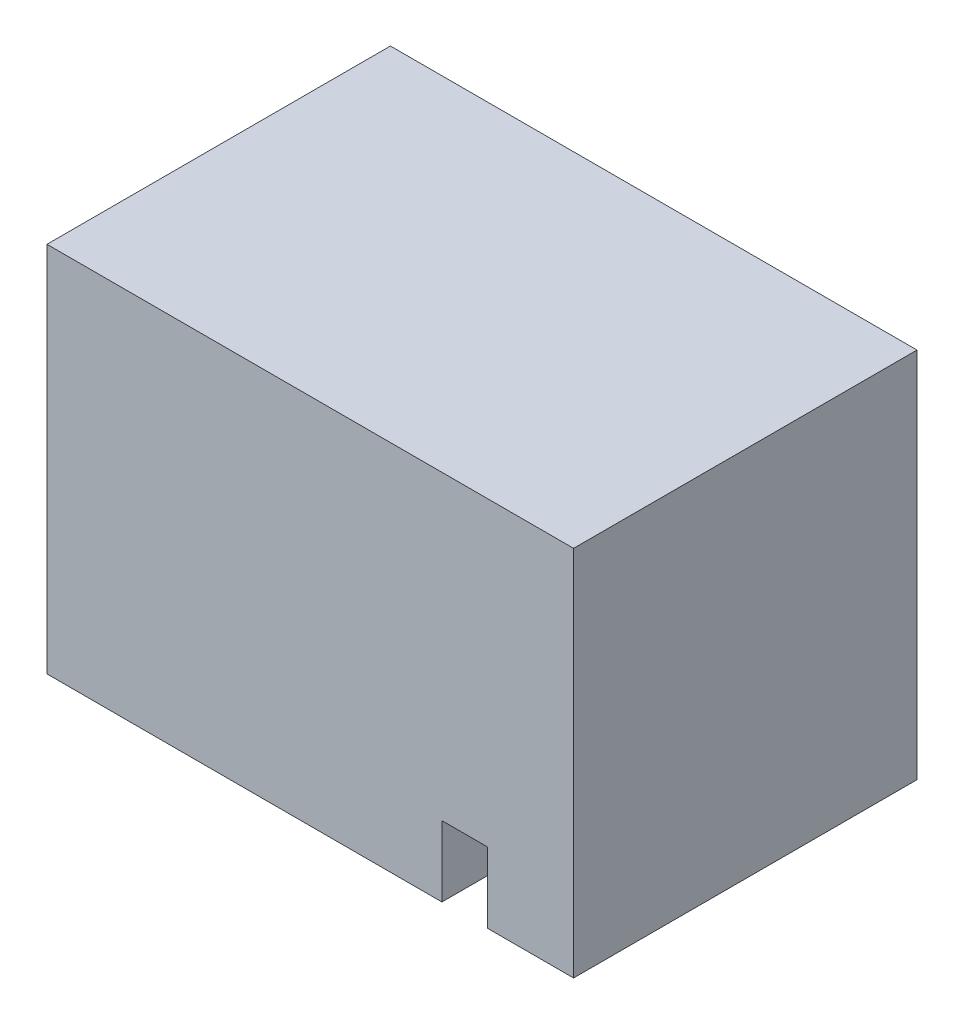
ISO-10303-21;
HEADER;
FILE_DESCRIPTION(('STEP AP214'),'2;1');
FILE_NAME('part.step','',(''),(''),'','','');
FILE_SCHEMA(('AUTOMOTIVE_DESIGN { 1 0 10303 214 1 1 1 1 }'));
ENDSEC;
DATA;
#1=APPLICATION_CONTEXT('core data for automotive mechanical design processes');
#2=APPLICATION_PROTOCOL_DEFINITION('international standard','automotive_design',2000,#1);
#3=PRODUCT_CONTEXT('',#1,'mechanical');
#4=PRODUCT('Part','Part','',(#3));
#5=PRODUCT_RELATED_PRODUCT_CATEGORY('part','',(#4));
#6=PRODUCT_DEFINITION_FORMATION('','',#4);
#7=PRODUCT_DEFINITION_CONTEXT('part definition',#1,'design');
#8=PRODUCT_DEFINITION('design','',#6,#7);
#9=PRODUCT_DEFINITION_SHAPE('','',#8);
#10=(LENGTH_UNIT() NAMED_UNIT(*) SI_UNIT(.MILLI.,.METRE.));
#11=(NAMED_UNIT(*) PLANE_ANGLE_UNIT() SI_UNIT($,.RADIAN.));
#12=(NAMED_UNIT(*) SI_UNIT($,.STERADIAN.) SOLID_ANGLE_UNIT());
#13=UNCERTAINTY_MEASURE_WITH_UNIT(LENGTH_MEASURE(1.E-05),#10,'distance_accuracy_value','');
#14=(GEOMETRIC_REPRESENTATION_CONTEXT(3) GLOBAL_UNCERTAINTY_ASSIGNED_CONTEXT((#13)) GLOBAL_UNIT_ASSIGNED_CONTEXT((#10,
#11,#12)) REPRESENTATION_CONTEXT('',''));
#15=CARTESIAN_POINT('',(0.,0.,0.));
#16=DIRECTION('',(0.,0.,1.));
#17=DIRECTION('',(1.,0.,0.));
#18=AXIS2_PLACEMENT_3D('',#15,#16,#17);
#19=CARTESIAN_POINT('',(0.,12.31,60.));
#20=DIRECTION('',(0.,1.,0.));
#21=DIRECTION('',(0.,0.,1.));
#22=AXIS2_PLACEMENT_3D('',#19,#20,#21);
#23=PLANE('',#22);
#24=DIRECTION('',(0.,0.,-1.));
#25=VECTOR('',#24,1.);
#26=CARTESIAN_POINT('',(69.,12.31,60.));
#27=LINE('',#26,#25);
#28=CARTESIAN_POINT('',(69.,12.31,60.));
#29=VERTEX_POINT('',#28);
#30=CARTESIAN_POINT('',(69.,12.31,26.01546));
#31=VERTEX_POINT('',#30);
#32=EDGE_CURVE('E54',#29,#31,#27,.T.);
#33=ORIENTED_EDGE('',*,*,#32,.T.);
#34=DIRECTION('',(1.,0.,0.));
#35=VECTOR('',#34,1.);
#36=CARTESIAN_POINT('',(0.,12.31,26.01546));
#37=LINE('',#36,#35);
#38=CARTESIAN_POINT('',(77.001,12.31,26.01546));
#39=VERTEX_POINT('',#38);
#40=EDGE_CURVE('E178',#31,#39,#37,.T.);
#41=ORIENTED_EDGE('',*,*,#40,.T.);
#42=DIRECTION('',(0.,0.,-1.));
#43=VECTOR('',#42,1.);
#44=CARTESIAN_POINT('',(77.001,12.31,60.));
#45=LINE('',#44,#43);
#46=CARTESIAN_POINT('',(77.001,12.31,60.));
#47=VERTEX_POINT('',#46);
#48=EDGE_CURVE('E245',#47,#39,#45,.T.);
#49=ORIENTED_EDGE('',*,*,#48,.F.);
#50=DIRECTION('',(1.,0.,0.));
#51=VECTOR('',#50,1.);
#52=CARTESIAN_POINT('',(0.,12.31,60.));
#53=LINE('',#52,#51);
#54=EDGE_CURVE('E193',#29,#47,#53,.T.);
#55=ORIENTED_EDGE('',*,*,#54,.F.);
#56=EDGE_LOOP('',(#33,#41,#49,#55));
#57=FACE_BOUND('',#56,.T.);
#58=DIRECTION('',(1.,0.,0.));
#59=VECTOR('',#58,1.);
#60=CARTESIAN_POINT('',(0.,12.31,31.00046));
#61=LINE('',#60,#59);
#62=CARTESIAN_POINT('',(72.0005,12.31,31.00046));
#63=VERTEX_POINT('',#62);
#64=CARTESIAN_POINT('',(74.0005,12.31,31.00046));
#65=VERTEX_POINT('',#64);
#66=EDGE_CURVE('E61',#63,#65,#61,.T.);
#67=ORIENTED_EDGE('',*,*,#66,.T.);
#68=DIRECTION('',(0.,0.,1.));
#69=VECTOR('',#68,1.);
#70=CARTESIAN_POINT('',(74.0005,12.31,0.));
#71=LINE('',#70,#69);
#72=CARTESIAN_POINT('',(74.0005,12.31,29.00046));
#73=VERTEX_POINT('',#72);
#74=EDGE_CURVE('E65',#73,#65,#71,.T.);
#75=ORIENTED_EDGE('',*,*,#74,.F.);
#76=DIRECTION('',(1.,0.,0.));
#77=VECTOR('',#76,1.);
#78=CARTESIAN_POINT('',(0.,12.31,29.00046));
#79=LINE('',#78,#77);
#80=CARTESIAN_POINT('',(72.0005,12.31,29.00046));
#81=VERTEX_POINT('',#80);
#82=EDGE_CURVE('E129',#81,#73,#79,.T.);
#83=ORIENTED_EDGE('',*,*,#82,.F.);
#84=DIRECTION('',(0.,0.,1.));
#85=VECTOR('',#84,1.);
#86=CARTESIAN_POINT('',(72.0005,12.31,0.));
#87=LINE('',#86,#85);
#88=EDGE_CURVE('E132',#81,#63,#87,.T.);
#89=ORIENTED_EDGE('',*,*,#88,.T.);
#90=EDGE_LOOP('',(#67,#75,#83,#89));
#91=FACE_BOUND('',#90,.T.);
#92=ADVANCED_FACE('F45',(#57,#91),#23,.F.);
#93=CARTESIAN_POINT('',(69.,0.,60.));
#94=DIRECTION('',(-1.,0.,0.));
#95=DIRECTION('',(0.,0.,1.));
#96=AXIS2_PLACEMENT_3D('',#93,#94,#95);
#97=PLANE('',#96);
#98=DIRECTION('',(0.,0.,-1.));
#99=VECTOR('',#98,1.);
#100=CARTESIAN_POINT('',(69.,0.,60.));
#101=LINE('',#100,#99);
#102=CARTESIAN_POINT('',(69.,0.,60.));
#103=VERTEX_POINT('',#102);
#104=CARTESIAN_POINT('',(69.,0.,26.01546));
#105=VERTEX_POINT('',#104);
#106=EDGE_CURVE('E11',#103,#105,#101,.T.);
#107=ORIENTED_EDGE('',*,*,#106,.T.);
#108=DIRECTION('',(0.,1.,0.));
#109=VECTOR('',#108,1.);
#110=CARTESIAN_POINT('',(69.,0.,26.01546));
#111=LINE('',#110,#109);
#112=EDGE_CURVE('E181',#105,#31,#111,.T.);
#113=ORIENTED_EDGE('',*,*,#112,.T.);
#114=ORIENTED_EDGE('',*,*,#32,.F.);
#115=DIRECTION('',(0.,1.,0.));
#116=VECTOR('',#115,1.);
#117=CARTESIAN_POINT('',(69.,0.,60.));
#118=LINE('',#117,#116);
#119=EDGE_CURVE('E189',#103,#29,#118,.T.);
#120=ORIENTED_EDGE('',*,*,#119,.F.);
#121=EDGE_LOOP('',(#107,#113,#114,#120));
#122=FACE_BOUND('',#121,.T.);
#123=ADVANCED_FACE('F47',(#122),#97,.F.);
#124=CARTESIAN_POINT('',(77.001,0.,60.));
#125=DIRECTION('',(1.,0.,0.));
#126=DIRECTION('',(0.,0.,-1.));
#127=AXIS2_PLACEMENT_3D('',#124,#125,#126);
#128=PLANE('',#127);
#129=ORIENTED_EDGE('',*,*,#48,.T.);
#130=DIRECTION('',(0.,1.,0.));
#131=VECTOR('',#130,1.);
#132=CARTESIAN_POINT('',(77.001,0.,26.01546));
#133=LINE('',#132,#131);
#134=CARTESIAN_POINT('',(77.001,0.,26.01546));
#135=VERTEX_POINT('',#134);
#136=EDGE_CURVE('E174',#135,#39,#133,.T.);
#137=ORIENTED_EDGE('',*,*,#136,.F.);
#138=DIRECTION('',(0.,0.,-1.));
#139=VECTOR('',#138,1.);
#140=CARTESIAN_POINT('',(77.001,0.,60.));
#141=LINE('',#140,#139);
#142=CARTESIAN_POINT('',(77.001,0.,60.));
#143=VERTEX_POINT('',#142);
#144=EDGE_CURVE('E241',#143,#135,#141,.T.);
#145=ORIENTED_EDGE('',*,*,#144,.F.);
#146=DIRECTION('',(0.,-1.,0.));
#147=VECTOR('',#146,1.);
#148=CARTESIAN_POINT('',(77.001,0.,60.));
#149=LINE('',#148,#147);
#150=EDGE_CURVE('E196',#47,#143,#149,.T.);
#151=ORIENTED_EDGE('',*,*,#150,.F.);
#152=EDGE_LOOP('',(#129,#137,#145,#151));
#153=FACE_BOUND('',#152,.T.);
#154=ADVANCED_FACE('F262',(#153),#128,.F.);
#155=CARTESIAN_POINT('',(0.,0.,60.));
#156=DIRECTION('',(0.,1.,0.));
#157=DIRECTION('',(-1.,0.,0.));
#158=AXIS2_PLACEMENT_3D('',#155,#156,#157);
#159=PLANE('',#158);
#160=DIRECTION('',(1.,0.,0.));
#161=VECTOR('',#160,1.);
#162=CARTESIAN_POINT('',(0.,0.,0.));
#163=LINE('',#162,#161);
#164=CARTESIAN_POINT('',(0.,0.,0.));
#165=VERTEX_POINT('',#164);
#166=CARTESIAN_POINT('',(92.001,0.,0.));
#167=VERTEX_POINT('',#166);
#168=EDGE_CURVE('E184',#165,#167,#163,.T.);
#169=ORIENTED_EDGE('',*,*,#168,.T.);
#170=DIRECTION('',(0.,0.,-1.));
#171=VECTOR('',#170,1.);
#172=CARTESIAN_POINT('',(92.001,0.,60.));
#173=LINE('',#172,#171);
#174=CARTESIAN_POINT('',(92.001,0.,60.));
#175=VERTEX_POINT('',#174);
#176=EDGE_CURVE('E238',#175,#167,#173,.T.);
#177=ORIENTED_EDGE('',*,*,#176,.F.);
#178=DIRECTION('',(1.,0.,0.));
#179=VECTOR('',#178,1.);
#180=CARTESIAN_POINT('',(0.,0.,60.));
#181=LINE('',#180,#179);
#182=EDGE_CURVE('E199',#143,#175,#181,.T.);
#183=ORIENTED_EDGE('',*,*,#182,.F.);
#184=ORIENTED_EDGE('',*,*,#144,.T.);
#185=DIRECTION('',(-1.,0.,0.));
#186=VECTOR('',#185,1.);
#187=CARTESIAN_POINT('',(0.,0.,26.01546));
#188=LINE('',#187,#186);
#189=EDGE_CURVE('E158',#135,#105,#188,.T.);
#190=ORIENTED_EDGE('',*,*,#189,.T.);
#191=ORIENTED_EDGE('',*,*,#106,.F.);
#192=DIRECTION('',(1.,0.,0.));
#193=VECTOR('',#192,1.);
#194=CARTESIAN_POINT('',(0.,0.,60.));
#195=LINE('',#194,#193);
#196=CARTESIAN_POINT('',(0.,0.,60.));
#197=VERTEX_POINT('',#196);
#198=EDGE_CURVE('E185',#197,#103,#195,.T.);
#199=ORIENTED_EDGE('',*,*,#198,.F.);
#200=DIRECTION('',(0.,0.,-1.));
#201=VECTOR('',#200,1.);
#202=CARTESIAN_POINT('',(0.,0.,60.));
#203=LINE('',#202,#201);
#204=EDGE_CURVE('E214',#197,#165,#203,.T.);
#205=ORIENTED_EDGE('',*,*,#204,.T.);
#206=EDGE_LOOP('',(#169,#177,#183,#184,#190,#191,#199,#205));
#207=FACE_BOUND('',#206,.T.);
#208=ADVANCED_FACE('F266',(#207),#159,.F.);
#209=CARTESIAN_POINT('',(92.001,0.,60.));
#210=DIRECTION('',(1.,0.,0.));
#211=DIRECTION('',(0.,1.,0.));
#212=AXIS2_PLACEMENT_3D('',#209,#210,#211);
#213=PLANE('',#212);
#214=DIRECTION('',(0.,-1.,0.));
#215=VECTOR('',#214,1.);
#216=CARTESIAN_POINT('',(92.001,0.,0.));
#217=LINE('',#216,#215);
#218=CARTESIAN_POINT('',(92.001,65.01,0.));
#219=VERTEX_POINT('',#218);
#220=EDGE_CURVE('E218',#219,#167,#217,.T.);
#221=ORIENTED_EDGE('',*,*,#220,.F.);
#222=DIRECTION('',(0.,0.,-1.));
#223=VECTOR('',#222,1.);
#224=CARTESIAN_POINT('',(92.001,65.01,60.));
#225=LINE('',#224,#223);
#226=CARTESIAN_POINT('',(92.001,65.01,60.));
#227=VERTEX_POINT('',#226);
#228=EDGE_CURVE('E235',#227,#219,#225,.T.);
#229=ORIENTED_EDGE('',*,*,#228,.F.);
#230=DIRECTION('',(0.,-1.,0.));
#231=VECTOR('',#230,1.);
#232=CARTESIAN_POINT('',(92.001,0.,60.));
#233=LINE('',#232,#231);
#234=EDGE_CURVE('E202',#227,#175,#233,.T.);
#235=ORIENTED_EDGE('',*,*,#234,.T.);
#236=ORIENTED_EDGE('',*,*,#176,.T.);
#237=EDGE_LOOP('',(#221,#229,#235,#236));
#238=FACE_BOUND('',#237,.T.);
#239=ADVANCED_FACE('F283',(#238),#213,.T.);
#240=CARTESIAN_POINT('',(0.,65.01,60.));
#241=DIRECTION('',(0.,1.,0.));
#242=DIRECTION('',(0.,0.,1.));
#243=AXIS2_PLACEMENT_3D('',#240,#241,#242);
#244=PLANE('',#243);
#245=DIRECTION('',(1.,0.,0.));
#246=VECTOR('',#245,1.);
#247=CARTESIAN_POINT('',(0.,65.01,0.));
#248=LINE('',#247,#246);
#249=CARTESIAN_POINT('',(0.,65.01,0.));
#250=VERTEX_POINT('',#249);
#251=EDGE_CURVE('E222',#250,#219,#248,.T.);
#252=ORIENTED_EDGE('',*,*,#251,.F.);
#253=DIRECTION('',(0.,0.,-1.));
#254=VECTOR('',#253,1.);
#255=CARTESIAN_POINT('',(0.,65.01,60.));
#256=LINE('',#255,#254);
#257=CARTESIAN_POINT('',(0.,65.01,60.));
#258=VERTEX_POINT('',#257);
#259=EDGE_CURVE('E232',#258,#250,#256,.T.);
#260=ORIENTED_EDGE('',*,*,#259,.F.);
#261=DIRECTION('',(1.,0.,0.));
#262=VECTOR('',#261,1.);
#263=CARTESIAN_POINT('',(0.,65.01,60.));
#264=LINE('',#263,#262);
#265=EDGE_CURVE('E206',#258,#227,#264,.T.);
#266=ORIENTED_EDGE('',*,*,#265,.T.);
#267=ORIENTED_EDGE('',*,*,#228,.T.);
#268=EDGE_LOOP('',(#252,#260,#266,#267));
#269=FACE_BOUND('',#268,.T.);
#270=ADVANCED_FACE('F285',(#269),#244,.T.);
#271=CARTESIAN_POINT('',(0.,0.,60.));
#272=DIRECTION('',(-1.,0.,0.));
#273=DIRECTION('',(0.,0.,1.));
#274=AXIS2_PLACEMENT_3D('',#271,#272,#273);
#275=PLANE('',#274);
#276=DIRECTION('',(0.,1.,0.));
#277=VECTOR('',#276,1.);
#278=CARTESIAN_POINT('',(0.,0.,0.));
#279=LINE('',#278,#277);
#280=EDGE_CURVE('E190',#165,#250,#279,.T.);
#281=ORIENTED_EDGE('',*,*,#280,.F.);
#282=ORIENTED_EDGE('',*,*,#204,.F.);
#283=DIRECTION('',(0.,1.,0.));
#284=VECTOR('',#283,1.);
#285=CARTESIAN_POINT('',(0.,0.,60.));
#286=LINE('',#285,#284);
#287=EDGE_CURVE('E210',#197,#258,#286,.T.);
#288=ORIENTED_EDGE('',*,*,#287,.T.);
#289=ORIENTED_EDGE('',*,*,#259,.T.);
#290=EDGE_LOOP('',(#281,#282,#288,#289));
#291=FACE_BOUND('',#290,.T.);
#292=ADVANCED_FACE('F277',(#291),#275,.T.);
#293=CARTESIAN_POINT('',(0.,0.,60.));
#294=DIRECTION('',(0.,0.,1.));
#295=DIRECTION('',(1.,0.,0.));
#296=AXIS2_PLACEMENT_3D('',#293,#294,#295);
#297=PLANE('',#296);
#298=ORIENTED_EDGE('',*,*,#198,.T.);
#299=ORIENTED_EDGE('',*,*,#119,.T.);
#300=ORIENTED_EDGE('',*,*,#54,.T.);
#301=ORIENTED_EDGE('',*,*,#150,.T.);
#302=ORIENTED_EDGE('',*,*,#182,.T.);
#303=ORIENTED_EDGE('',*,*,#234,.F.);
#304=ORIENTED_EDGE('',*,*,#265,.F.);
#305=ORIENTED_EDGE('',*,*,#287,.F.);
#306=EDGE_LOOP('',(#298,#299,#300,#301,#302,#303,#304,#305));
#307=FACE_BOUND('',#306,.T.);
#308=ADVANCED_FACE('F271',(#307),#297,.T.);
#309=CARTESIAN_POINT('',(0.,0.,0.));
#310=DIRECTION('',(0.,0.,1.));
#311=DIRECTION('',(1.,0.,0.));
#312=AXIS2_PLACEMENT_3D('',#309,#310,#311);
#313=PLANE('',#312);
#314=ORIENTED_EDGE('',*,*,#168,.F.);
#315=ORIENTED_EDGE('',*,*,#280,.T.);
#316=ORIENTED_EDGE('',*,*,#251,.T.);
#317=ORIENTED_EDGE('',*,*,#220,.T.);
#318=EDGE_LOOP('',(#314,#315,#316,#317));
#319=FACE_BOUND('',#318,.T.);
#320=ADVANCED_FACE('F280',(#319),#313,.F.);
#321=CARTESIAN_POINT('',(0.,0.,26.01546));
#322=DIRECTION('',(0.,0.,1.));
#323=DIRECTION('',(1.,0.,0.));
#324=AXIS2_PLACEMENT_3D('',#321,#322,#323);
#325=PLANE('',#324);
#326=ORIENTED_EDGE('',*,*,#189,.F.);
#327=ORIENTED_EDGE('',*,*,#136,.T.);
#328=ORIENTED_EDGE('',*,*,#40,.F.);
#329=ORIENTED_EDGE('',*,*,#112,.F.);
#330=EDGE_LOOP('',(#326,#327,#328,#329));
#331=FACE_BOUND('',#330,.T.);
#332=ADVANCED_FACE('F259',(#331),#325,.T.);
#333=CARTESIAN_POINT('',(0.,15.1384271247462,31.00046));
#334=DIRECTION('',(0.,0.,-1.));
#335=DIRECTION('',(-1.,0.,0.));
#336=AXIS2_PLACEMENT_3D('',#333,#334,#335);
#337=PLANE('',#336);
#338=ORIENTED_EDGE('',*,*,#66,.F.);
#339=DIRECTION('',(0.,-1.,0.));
#340=VECTOR('',#339,1.);
#341=CARTESIAN_POINT('',(72.0005,15.1384271247462,31.00046));
#342=LINE('',#341,#340);
#343=CARTESIAN_POINT('',(72.0005,0.,31.00046));
#344=VERTEX_POINT('',#343);
#345=EDGE_CURVE('E152',#63,#344,#342,.T.);
#346=ORIENTED_EDGE('',*,*,#345,.T.);
#347=DIRECTION('',(1.,0.,0.));
#348=VECTOR('',#347,1.);
#349=CARTESIAN_POINT('',(0.,0.,31.00046));
#350=LINE('',#349,#348);
#351=CARTESIAN_POINT('',(74.0005,0.,31.00046));
#352=VERTEX_POINT('',#351);
#353=EDGE_CURVE('E170',#344,#352,#350,.T.);
#354=ORIENTED_EDGE('',*,*,#353,.T.);
#355=DIRECTION('',(0.,-1.,0.));
#356=VECTOR('',#355,1.);
#357=CARTESIAN_POINT('',(74.0005,15.1384271247462,31.00046));
#358=LINE('',#357,#356);
#359=EDGE_CURVE('E138',#65,#352,#358,.T.);
#360=ORIENTED_EDGE('',*,*,#359,.F.);
#361=EDGE_LOOP('',(#338,#346,#354,#360));
#362=FACE_BOUND('',#361,.T.);
#363=ADVANCED_FACE('F398',(#362),#337,.F.);
#364=CARTESIAN_POINT('',(74.0005,15.1384271247462,0.));
#365=DIRECTION('',(1.,0.,0.));
#366=DIRECTION('',(0.,1.,0.));
#367=AXIS2_PLACEMENT_3D('',#364,#365,#366);
#368=PLANE('',#367);
#369=DIRECTION('',(0.,-1.,0.));
#370=VECTOR('',#369,1.);
#371=CARTESIAN_POINT('',(74.0005,15.1384271247462,29.00046));
#372=LINE('',#371,#370);
#373=CARTESIAN_POINT('',(74.0005,0.,29.00046));
#374=VERTEX_POINT('',#373);
#375=EDGE_CURVE('E137',#73,#374,#372,.T.);
#376=ORIENTED_EDGE('',*,*,#375,.F.);
#377=ORIENTED_EDGE('',*,*,#74,.T.);
#378=ORIENTED_EDGE('',*,*,#359,.T.);
#379=DIRECTION('',(0.,0.,1.));
#380=VECTOR('',#379,1.);
#381=CARTESIAN_POINT('',(74.0005,0.,0.));
#382=LINE('',#381,#380);
#383=EDGE_CURVE('E154',#374,#352,#382,.T.);
#384=ORIENTED_EDGE('',*,*,#383,.F.);
#385=EDGE_LOOP('',(#376,#377,#378,#384));
#386=FACE_BOUND('',#385,.T.);
#387=ADVANCED_FACE('F415',(#386),#368,.T.);
#388=CARTESIAN_POINT('',(0.,15.1384271247462,29.00046));
#389=DIRECTION('',(0.,0.,-1.));
#390=DIRECTION('',(-1.,0.,0.));
#391=AXIS2_PLACEMENT_3D('',#388,#389,#390);
#392=PLANE('',#391);
#393=DIRECTION('',(0.,-1.,0.));
#394=VECTOR('',#393,1.);
#395=CARTESIAN_POINT('',(72.0005,15.1384271247462,29.00046));
#396=LINE('',#395,#394);
#397=CARTESIAN_POINT('',(72.0005,0.,29.00046));
#398=VERTEX_POINT('',#397);
#399=EDGE_CURVE('E141',#81,#398,#396,.T.);
#400=ORIENTED_EDGE('',*,*,#399,.F.);
#401=ORIENTED_EDGE('',*,*,#82,.T.);
#402=ORIENTED_EDGE('',*,*,#375,.T.);
#403=DIRECTION('',(1.,0.,0.));
#404=VECTOR('',#403,1.);
#405=CARTESIAN_POINT('',(0.,0.,29.00046));
#406=LINE('',#405,#404);
#407=EDGE_CURVE('E144',#398,#374,#406,.T.);
#408=ORIENTED_EDGE('',*,*,#407,.F.);
#409=EDGE_LOOP('',(#400,#401,#402,#408));
#410=FACE_BOUND('',#409,.T.);
#411=ADVANCED_FACE('F142',(#410),#392,.T.);
#412=CARTESIAN_POINT('',(72.0005,15.1384271247462,0.));
#413=DIRECTION('',(1.,0.,0.));
#414=DIRECTION('',(0.,1.,0.));
#415=AXIS2_PLACEMENT_3D('',#412,#413,#414);
#416=PLANE('',#415);
#417=ORIENTED_EDGE('',*,*,#88,.F.);
#418=ORIENTED_EDGE('',*,*,#399,.T.);
#419=DIRECTION('',(0.,0.,1.));
#420=VECTOR('',#419,1.);
#421=CARTESIAN_POINT('',(72.0005,0.,0.));
#422=LINE('',#421,#420);
#423=EDGE_CURVE('E149',#398,#344,#422,.T.);
#424=ORIENTED_EDGE('',*,*,#423,.T.);
#425=ORIENTED_EDGE('',*,*,#345,.F.);
#426=EDGE_LOOP('',(#417,#418,#424,#425));
#427=FACE_BOUND('',#426,.T.);
#428=ADVANCED_FACE('F151',(#427),#416,.F.);
#429=CARTESIAN_POINT('',(0.,0.,0.));
#430=DIRECTION('',(0.,-1.,0.));
#431=DIRECTION('',(1.,0.,0.));
#432=AXIS2_PLACEMENT_3D('',#429,#430,#431);
#433=PLANE('',#432);
#434=ORIENTED_EDGE('',*,*,#353,.F.);
#435=ORIENTED_EDGE('',*,*,#423,.F.);
#436=ORIENTED_EDGE('',*,*,#407,.T.);
#437=ORIENTED_EDGE('',*,*,#383,.T.);
#438=EDGE_LOOP('',(#434,#435,#436,#437));
#439=FACE_BOUND('',#438,.T.);
#440=ADVANCED_FACE('F441',(#439),#433,.T.);
#441=CLOSED_SHELL('',(#92,#123,#154,#208,#239,#270,#292,#308,#320,#332,#363,#387,#411,#428,#440));
#442=MANIFOLD_SOLID_BREP('B2',#441);
#443=ADVANCED_BREP_SHAPE_REPRESENTATION('',(#18,#442),#14);
#444=SHAPE_DEFINITION_REPRESENTATION(#9,#443);
ENDSEC;
END-ISO-10303-21;
